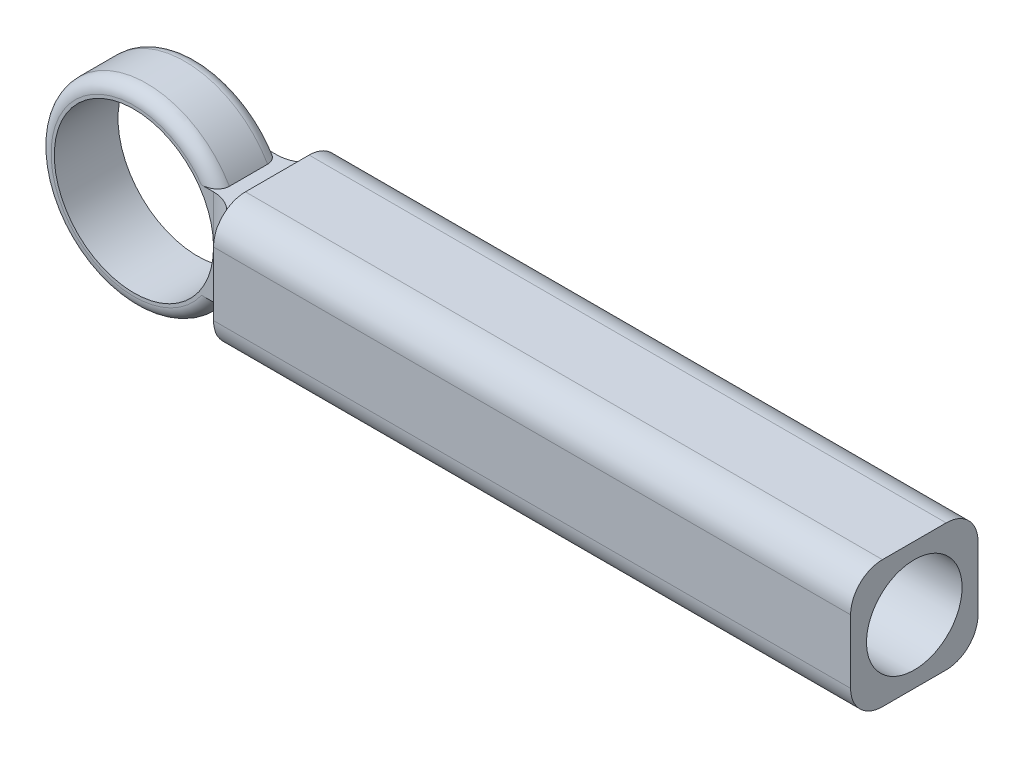
ISO-10303-21;
HEADER;
FILE_DESCRIPTION(('STEP AP214'),'2;1');
FILE_NAME('part.step','',(''),(''),'','','');
FILE_SCHEMA(('AUTOMOTIVE_DESIGN { 1 0 10303 214 1 1 1 1 }'));
ENDSEC;
DATA;
#1=APPLICATION_CONTEXT('core data for automotive mechanical design processes');
#2=APPLICATION_PROTOCOL_DEFINITION('international standard','automotive_design',2000,#1);
#3=PRODUCT_CONTEXT('',#1,'mechanical');
#4=PRODUCT('Part','Part','',(#3));
#5=PRODUCT_RELATED_PRODUCT_CATEGORY('part','',(#4));
#6=PRODUCT_DEFINITION_FORMATION('','',#4);
#7=PRODUCT_DEFINITION_CONTEXT('part definition',#1,'design');
#8=PRODUCT_DEFINITION('design','',#6,#7);
#9=PRODUCT_DEFINITION_SHAPE('','',#8);
#10=(LENGTH_UNIT() NAMED_UNIT(*) SI_UNIT(.MILLI.,.METRE.));
#11=(NAMED_UNIT(*) PLANE_ANGLE_UNIT() SI_UNIT($,.RADIAN.));
#12=(NAMED_UNIT(*) SI_UNIT($,.STERADIAN.) SOLID_ANGLE_UNIT());
#13=UNCERTAINTY_MEASURE_WITH_UNIT(LENGTH_MEASURE(1.E-05),#10,'distance_accuracy_value','');
#14=(GEOMETRIC_REPRESENTATION_CONTEXT(3) GLOBAL_UNCERTAINTY_ASSIGNED_CONTEXT((#13)) GLOBAL_UNIT_ASSIGNED_CONTEXT((#10,
#11,#12)) REPRESENTATION_CONTEXT('',''));
#15=CARTESIAN_POINT('',(0.,0.,0.));
#16=DIRECTION('',(0.,0.,1.));
#17=DIRECTION('',(1.,0.,0.));
#18=AXIS2_PLACEMENT_3D('',#15,#16,#17);
#19=CARTESIAN_POINT('',(3.5,0.,0.));
#20=DIRECTION('',(1.,0.,0.));
#21=DIRECTION('',(0.,0.,-1.));
#22=AXIS2_PLACEMENT_3D('',#19,#20,#21);
#23=PLANE('',#22);
#24=CARTESIAN_POINT('',(3.5,-0.999999999999999,2.));
#25=DIRECTION('',(1.,0.,0.));
#26=DIRECTION('',(0.,0.,-1.));
#27=AXIS2_PLACEMENT_3D('',#24,#25,#26);
#28=CIRCLE('',#27,1.);
#29=CARTESIAN_POINT('',(3.5,-2.,2.));
#30=VERTEX_POINT('',#29);
#31=CARTESIAN_POINT('',(3.5,-1.5,2.86602540378444));
#32=VERTEX_POINT('',#31);
#33=EDGE_CURVE('E463',#30,#32,#28,.F.);
#34=ORIENTED_EDGE('',*,*,#33,.T.);
#35=DIRECTION('',(0.,0.,-1.));
#36=VECTOR('',#35,1.);
#37=CARTESIAN_POINT('',(3.5,-1.5,2.));
#38=LINE('',#37,#36);
#39=CARTESIAN_POINT('',(3.5,-1.5,-0.866025403784438));
#40=VERTEX_POINT('',#39);
#41=EDGE_CURVE('E422',#32,#40,#38,.T.);
#42=ORIENTED_EDGE('',*,*,#41,.T.);
#43=CARTESIAN_POINT('',(3.5,-0.999999999999999,0.));
#44=DIRECTION('',(1.,0.,0.));
#45=DIRECTION('',(0.,0.,-1.));
#46=AXIS2_PLACEMENT_3D('',#43,#44,#45);
#47=CIRCLE('',#46,1.);
#48=CARTESIAN_POINT('',(3.5,-2.,0.));
#49=VERTEX_POINT('',#48);
#50=EDGE_CURVE('E461',#40,#49,#47,.F.);
#51=ORIENTED_EDGE('',*,*,#50,.T.);
#52=DIRECTION('',(0.,0.,-1.));
#53=VECTOR('',#52,1.);
#54=CARTESIAN_POINT('',(3.5,-2.,3.));
#55=LINE('',#54,#53);
#56=EDGE_CURVE('E381',#30,#49,#55,.T.);
#57=ORIENTED_EDGE('',*,*,#56,.F.);
#58=EDGE_LOOP('',(#34,#42,#51,#57));
#59=FACE_BOUND('',#58,.T.);
#60=ADVANCED_FACE('F43',(#59),#23,.F.);
#61=CARTESIAN_POINT('',(0.,0.,2.));
#62=DIRECTION('',(0.,0.,1.));
#63=DIRECTION('',(1.,0.,0.));
#64=AXIS2_PLACEMENT_3D('',#61,#62,#63);
#65=PLANE('',#64);
#66=CARTESIAN_POINT('',(0.,0.,2.));
#67=DIRECTION('',(0.,0.,1.));
#68=DIRECTION('',(1.,0.,0.));
#69=AXIS2_PLACEMENT_3D('',#66,#67,#68);
#70=CIRCLE('',#69,2.6);
#71=CARTESIAN_POINT('',(2.12367605815953,1.5,2.));
#72=VERTEX_POINT('',#71);
#73=CARTESIAN_POINT('',(2.12367605815953,-1.5,2.));
#74=VERTEX_POINT('',#73);
#75=EDGE_CURVE('E400',#72,#74,#70,.T.);
#76=ORIENTED_EDGE('',*,*,#75,.T.);
#77=DIRECTION('',(1.,0.,0.));
#78=VECTOR('',#77,1.);
#79=CARTESIAN_POINT('',(3.5,-1.5,2.));
#80=LINE('',#79,#78);
#81=CARTESIAN_POINT('',(2.5,-1.5,2.));
#82=VERTEX_POINT('',#81);
#83=EDGE_CURVE('E395',#74,#82,#80,.T.);
#84=ORIENTED_EDGE('',*,*,#83,.T.);
#85=DIRECTION('',(0.,1.,0.));
#86=VECTOR('',#85,1.);
#87=CARTESIAN_POINT('',(2.5,0.,2.));
#88=LINE('',#87,#86);
#89=CARTESIAN_POINT('',(2.5,0.,2.));
#90=VERTEX_POINT('',#89);
#91=EDGE_CURVE('E392',#82,#90,#88,.T.);
#92=ORIENTED_EDGE('',*,*,#91,.T.);
#93=CARTESIAN_POINT('',(0.,0.,2.));
#94=DIRECTION('',(0.,0.,1.));
#95=DIRECTION('',(1.,0.,0.));
#96=AXIS2_PLACEMENT_3D('',#93,#94,#95);
#97=CIRCLE('',#96,2.5);
#98=EDGE_CURVE('E428',#90,#90,#97,.T.);
#99=ORIENTED_EDGE('',*,*,#98,.F.);
#100=DIRECTION('',(0.,1.,0.));
#101=VECTOR('',#100,1.);
#102=CARTESIAN_POINT('',(2.5,0.,2.));
#103=LINE('',#102,#101);
#104=CARTESIAN_POINT('',(2.5,1.5,2.));
#105=VERTEX_POINT('',#104);
#106=EDGE_CURVE('E427',#90,#105,#103,.T.);
#107=ORIENTED_EDGE('',*,*,#106,.T.);
#108=DIRECTION('',(-1.,0.,0.));
#109=VECTOR('',#108,1.);
#110=CARTESIAN_POINT('',(2.59807621135332,1.5,2.));
#111=LINE('',#110,#109);
#112=EDGE_CURVE('E231',#105,#72,#111,.T.);
#113=ORIENTED_EDGE('',*,*,#112,.T.);
#114=EDGE_LOOP('',(#76,#84,#92,#99,#107,#113));
#115=FACE_BOUND('',#114,.T.);
#116=ADVANCED_FACE('F332',(#115),#65,.T.);
#117=CARTESIAN_POINT('',(0.,0.,0.));
#118=DIRECTION('',(0.,0.,1.));
#119=DIRECTION('',(1.,0.,0.));
#120=AXIS2_PLACEMENT_3D('',#117,#118,#119);
#121=PLANE('',#120);
#122=DIRECTION('',(0.,1.,0.));
#123=VECTOR('',#122,1.);
#124=CARTESIAN_POINT('',(2.5,-1.5,0.));
#125=LINE('',#124,#123);
#126=CARTESIAN_POINT('',(2.5,0.,0.));
#127=VERTEX_POINT('',#126);
#128=CARTESIAN_POINT('',(2.5,-1.5,0.));
#129=VERTEX_POINT('',#128);
#130=EDGE_CURVE('E433',#127,#129,#125,.F.);
#131=ORIENTED_EDGE('',*,*,#130,.T.);
#132=DIRECTION('',(-1.,0.,0.));
#133=VECTOR('',#132,1.);
#134=CARTESIAN_POINT('',(0.,-1.5,0.));
#135=LINE('',#134,#133);
#136=CARTESIAN_POINT('',(2.12367605815953,-1.5,0.));
#137=VERTEX_POINT('',#136);
#138=EDGE_CURVE('E413',#129,#137,#135,.T.);
#139=ORIENTED_EDGE('',*,*,#138,.T.);
#140=CARTESIAN_POINT('',(0.,0.,0.));
#141=DIRECTION('',(0.,0.,1.));
#142=DIRECTION('',(1.,0.,0.));
#143=AXIS2_PLACEMENT_3D('',#140,#141,#142);
#144=CIRCLE('',#143,2.6);
#145=CARTESIAN_POINT('',(2.12367605815953,1.5,0.));
#146=VERTEX_POINT('',#145);
#147=EDGE_CURVE('E411',#137,#146,#144,.F.);
#148=ORIENTED_EDGE('',*,*,#147,.T.);
#149=DIRECTION('',(1.,0.,0.));
#150=VECTOR('',#149,1.);
#151=CARTESIAN_POINT('',(0.,1.5,0.));
#152=LINE('',#151,#150);
#153=CARTESIAN_POINT('',(2.5,1.5,0.));
#154=VERTEX_POINT('',#153);
#155=EDGE_CURVE('E408',#146,#154,#152,.T.);
#156=ORIENTED_EDGE('',*,*,#155,.T.);
#157=DIRECTION('',(0.,1.,0.));
#158=VECTOR('',#157,1.);
#159=CARTESIAN_POINT('',(2.5,-1.5,0.));
#160=LINE('',#159,#158);
#161=EDGE_CURVE('E429',#154,#127,#160,.F.);
#162=ORIENTED_EDGE('',*,*,#161,.T.);
#163=CARTESIAN_POINT('',(0.,0.,0.));
#164=DIRECTION('',(0.,0.,1.));
#165=DIRECTION('',(1.,0.,0.));
#166=AXIS2_PLACEMENT_3D('',#163,#164,#165);
#167=CIRCLE('',#166,2.5);
#168=EDGE_CURVE('E468',#127,#127,#167,.T.);
#169=ORIENTED_EDGE('',*,*,#168,.T.);
#170=EDGE_LOOP('',(#131,#139,#148,#156,#162,#169));
#171=FACE_BOUND('',#170,.T.);
#172=ADVANCED_FACE('F319',(#171),#121,.F.);
#173=CARTESIAN_POINT('',(0.,0.,2.));
#174=DIRECTION('',(0.,0.,-1.));
#175=DIRECTION('',(-1.,0.,0.));
#176=AXIS2_PLACEMENT_3D('',#173,#174,#175);
#177=CYLINDRICAL_SURFACE('',#176,3.);
#178=DIRECTION('',(0.,0.,-1.));
#179=VECTOR('',#178,1.);
#180=CARTESIAN_POINT('',(2.59807621135332,-1.5,2.));
#181=LINE('',#180,#179);
#182=CARTESIAN_POINT('',(2.59807621135332,-1.5,1.6));
#183=VERTEX_POINT('',#182);
#184=CARTESIAN_POINT('',(2.59807621135332,-1.5,0.4));
#185=VERTEX_POINT('',#184);
#186=EDGE_CURVE('E193',#183,#185,#181,.T.);
#187=ORIENTED_EDGE('',*,*,#186,.F.);
#188=CARTESIAN_POINT('',(0.,0.,1.6));
#189=DIRECTION('',(0.,0.,1.));
#190=DIRECTION('',(1.,0.,0.));
#191=AXIS2_PLACEMENT_3D('',#188,#189,#190);
#192=CIRCLE('',#191,3.);
#193=CARTESIAN_POINT('',(2.59807621135332,1.5,1.6));
#194=VERTEX_POINT('',#193);
#195=EDGE_CURVE('E404',#183,#194,#192,.F.);
#196=ORIENTED_EDGE('',*,*,#195,.T.);
#197=DIRECTION('',(0.,0.,-1.));
#198=VECTOR('',#197,1.);
#199=CARTESIAN_POINT('',(2.59807621135332,1.5,2.));
#200=LINE('',#199,#198);
#201=CARTESIAN_POINT('',(2.59807621135332,1.5,0.4));
#202=VERTEX_POINT('',#201);
#203=EDGE_CURVE('E426',#194,#202,#200,.T.);
#204=ORIENTED_EDGE('',*,*,#203,.T.);
#205=CARTESIAN_POINT('',(0.,0.,0.4));
#206=DIRECTION('',(0.,0.,1.));
#207=DIRECTION('',(1.,0.,0.));
#208=AXIS2_PLACEMENT_3D('',#205,#206,#207);
#209=CIRCLE('',#208,3.);
#210=EDGE_CURVE('E401',#202,#185,#209,.T.);
#211=ORIENTED_EDGE('',*,*,#210,.T.);
#212=EDGE_LOOP('',(#187,#196,#204,#211));
#213=FACE_BOUND('',#212,.T.);
#214=ADVANCED_FACE('F324',(#213),#177,.T.);
#215=CARTESIAN_POINT('',(3.5,-1.5,2.));
#216=DIRECTION('',(0.,1.,0.));
#217=DIRECTION('',(0.,0.,1.));
#218=AXIS2_PLACEMENT_3D('',#215,#216,#217);
#219=PLANE('',#218);
#220=CARTESIAN_POINT('',(2.5,-1.5,-1.));
#221=DIRECTION('',(0.,1.,0.));
#222=DIRECTION('',(0.,0.,1.));
#223=AXIS2_PLACEMENT_3D('',#220,#221,#222);
#224=CIRCLE('',#223,1.);
#225=CARTESIAN_POINT('',(3.49098476656752,-1.5,-0.866025403784438));
#226=VERTEX_POINT('',#225);
#227=EDGE_CURVE('E64',#129,#226,#224,.T.);
#228=ORIENTED_EDGE('',*,*,#227,.T.);
#229=DIRECTION('',(-1.,0.,0.));
#230=VECTOR('',#229,1.);
#231=CARTESIAN_POINT('',(3.5,-1.5,-0.866025403784438));
#232=LINE('',#231,#230);
#233=EDGE_CURVE('E224',#226,#40,#232,.F.);
#234=ORIENTED_EDGE('',*,*,#233,.T.);
#235=ORIENTED_EDGE('',*,*,#41,.F.);
#236=DIRECTION('',(1.,0.,0.));
#237=VECTOR('',#236,1.);
#238=CARTESIAN_POINT('',(3.49098476656752,-1.5,2.86602540378444));
#239=LINE('',#238,#237);
#240=CARTESIAN_POINT('',(3.49098476656752,-1.5,2.86602540378444));
#241=VERTEX_POINT('',#240);
#242=EDGE_CURVE('E222',#32,#241,#239,.F.);
#243=ORIENTED_EDGE('',*,*,#242,.T.);
#244=CARTESIAN_POINT('',(2.5,-1.5,3.));
#245=DIRECTION('',(0.,1.,0.));
#246=DIRECTION('',(0.,0.,1.));
#247=AXIS2_PLACEMENT_3D('',#244,#245,#246);
#248=CIRCLE('',#247,1.);
#249=EDGE_CURVE('E220',#241,#82,#248,.T.);
#250=ORIENTED_EDGE('',*,*,#249,.T.);
#251=ORIENTED_EDGE('',*,*,#83,.F.);
#252=CARTESIAN_POINT('',(2.12367605815953,-1.5,2.));
#253=CARTESIAN_POINT('',(2.15758585713339,-1.5,2.00001594511872));
#254=CARTESIAN_POINT('',(2.19160700873993,-1.5,1.99712058292618));
#255=CARTESIAN_POINT('',(2.25871829493161,-1.5,1.98524059464232));
#256=CARTESIAN_POINT('',(2.2918033616741,-1.5,1.97622770154308));
#257=CARTESIAN_POINT('',(2.34807344863793,-1.5,1.95470101168538));
#258=CARTESIAN_POINT('',(2.37176046944167,-1.5,1.94350407902903));
#259=CARTESIAN_POINT('',(2.4169449606432,-1.5,1.91737917499726));
#260=CARTESIAN_POINT('',(2.43844661310747,-1.5,1.90245852624708));
#261=CARTESIAN_POINT('',(2.47861366374873,-1.5,1.86886583896444));
#262=CARTESIAN_POINT('',(2.49725505420123,-1.5,1.85016480876899));
#263=CARTESIAN_POINT('',(2.53053058040978,-1.5,1.80944706330995));
#264=CARTESIAN_POINT('',(2.54516535009081,-1.5,1.7874308734242));
#265=CARTESIAN_POINT('',(2.56782449846648,-1.5,1.74399924746709));
#266=CARTESIAN_POINT('',(2.5764779732599,-1.5,1.7229108974363));
#267=CARTESIAN_POINT('',(2.58959711767569,-1.5,1.67949612879297));
#268=CARTESIAN_POINT('',(2.59407438084941,-1.5,1.65717332099209));
#269=CARTESIAN_POINT('',(2.59691758118529,-1.5,1.62890627121276));
#270=CARTESIAN_POINT('',(2.59735213368728,-1.5,1.6231293295965));
#271=CARTESIAN_POINT('',(2.59793096041084,-1.5,1.61156916816617));
#272=CARTESIAN_POINT('',(2.59807564761839,-1.5,1.60578596904679));
#273=CARTESIAN_POINT('',(2.59807621135332,-1.5,1.6));
#274=B_SPLINE_CURVE_WITH_KNOTS('',3,(#252,#253,#254,#255,#256,#257,#258,#259,#260,#261,#262,
#263,#264,#265,#266,#267,#268,#269,#270,#271,#272,#273),.UNSPECIFIED.,.F.,.F.,(4,2,2,2,2,2,2,2,
2,2,4),(0.,0.101790309340811,0.20405418768438,0.282333468915692,0.360460011743565,
0.439210131703286,0.517947784659056,0.585954095671942,0.653771048006571,0.671146386877188,
0.688496952554313),.UNSPECIFIED.);
#275=EDGE_CURVE('E295',#74,#183,#274,.T.);
#276=ORIENTED_EDGE('',*,*,#275,.T.);
#277=ORIENTED_EDGE('',*,*,#186,.T.);
#278=CARTESIAN_POINT('',(2.59807621135332,-1.5,0.4));
#279=CARTESIAN_POINT('',(2.59810523239083,-1.5,0.379736288779023));
#280=CARTESIAN_POINT('',(2.59630032819509,-1.5,0.359493173056112));
#281=CARTESIAN_POINT('',(2.58925527858618,-1.5,0.319694954398469));
#282=CARTESIAN_POINT('',(2.58402904895933,-1.5,0.300137401083211));
#283=CARTESIAN_POINT('',(2.57037530130759,-1.5,0.262197205596292));
#284=CARTESIAN_POINT('',(2.56194998191511,-1.5,0.243813766607403));
#285=CARTESIAN_POINT('',(2.54226366848401,-1.5,0.208627042029602));
#286=CARTESIAN_POINT('',(2.53100051713219,-1.5,0.191824972001496));
#287=CARTESIAN_POINT('',(2.50548588387801,-1.5,0.159397956274254));
#288=CARTESIAN_POINT('',(2.4911206336654,-1.5,0.143862904032949));
#289=CARTESIAN_POINT('',(2.46025242501246,-1.5,0.115105431437132));
#290=CARTESIAN_POINT('',(2.44374934475632,-1.5,0.101883142967315));
#291=CARTESIAN_POINT('',(2.40690622930586,-1.5,0.0763561290609208));
#292=CARTESIAN_POINT('',(2.38634439858952,-1.5,0.0643721556439394));
#293=CARTESIAN_POINT('',(2.34368426868376,-1.5,0.0434877432512681));
#294=CARTESIAN_POINT('',(2.32158335879466,-1.5,0.0345927048362297));
#295=CARTESIAN_POINT('',(2.2707121652535,-1.5,0.0180145681281334));
#296=CARTESIAN_POINT('',(2.24166058517029,-1.5,0.0111964952975033));
#297=CARTESIAN_POINT('',(2.18294256544403,-1.5,0.00219367168048551));
#298=CARTESIAN_POINT('',(2.15327857439571,-1.5,-6.87900282646229E-06));
#299=CARTESIAN_POINT('',(2.12367605815953,-1.5,0.));
#300=B_SPLINE_CURVE_WITH_KNOTS('',3,(#278,#279,#280,#281,#282,#283,#284,#285,#286,#287,#288,
#289,#290,#291,#292,#293,#294,#295,#296,#297,#298,#299),.UNSPECIFIED.,.F.,.F.,(4,2,2,2,2,2,2,2,
2,2,4),(0.,0.0606786315460023,0.121111981538572,0.181503872574434,0.241941812637233,
0.305164170117127,0.368390131659381,0.439511226408976,0.510756047468925,0.599888741430194,
0.688715947022926),.UNSPECIFIED.);
#301=EDGE_CURVE('E57',#185,#137,#300,.T.);
#302=ORIENTED_EDGE('',*,*,#301,.T.);
#303=ORIENTED_EDGE('',*,*,#138,.F.);
#304=EDGE_LOOP('',(#228,#234,#235,#243,#250,#251,#276,#277,#302,#303));
#305=FACE_BOUND('',#304,.T.);
#306=ADVANCED_FACE('F317',(#305),#219,.F.);
#307=CARTESIAN_POINT('',(2.59807621135332,1.5,2.));
#308=DIRECTION('',(0.,-1.,0.));
#309=DIRECTION('',(0.,0.,-1.));
#310=AXIS2_PLACEMENT_3D('',#307,#308,#309);
#311=PLANE('',#310);
#312=DIRECTION('',(0.,0.,-1.));
#313=VECTOR('',#312,1.);
#314=CARTESIAN_POINT('',(3.5,1.5,2.));
#315=LINE('',#314,#313);
#316=CARTESIAN_POINT('',(3.5,1.5,2.86602540378444));
#317=VERTEX_POINT('',#316);
#318=CARTESIAN_POINT('',(3.5,1.5,-0.866025403784439));
#319=VERTEX_POINT('',#318);
#320=EDGE_CURVE('E187',#317,#319,#315,.T.);
#321=ORIENTED_EDGE('',*,*,#320,.T.);
#322=DIRECTION('',(1.,0.,0.));
#323=VECTOR('',#322,1.);
#324=CARTESIAN_POINT('',(3.49098476656752,1.5,-0.866025403784439));
#325=LINE('',#324,#323);
#326=CARTESIAN_POINT('',(3.49098476656752,1.5,-0.866025403784439));
#327=VERTEX_POINT('',#326);
#328=EDGE_CURVE('E227',#319,#327,#325,.F.);
#329=ORIENTED_EDGE('',*,*,#328,.T.);
#330=CARTESIAN_POINT('',(2.5,1.5,-1.));
#331=DIRECTION('',(0.,-1.,0.));
#332=DIRECTION('',(0.,0.,-1.));
#333=AXIS2_PLACEMENT_3D('',#330,#331,#332);
#334=CIRCLE('',#333,1.);
#335=EDGE_CURVE('E211',#327,#154,#334,.T.);
#336=ORIENTED_EDGE('',*,*,#335,.T.);
#337=ORIENTED_EDGE('',*,*,#155,.F.);
#338=CARTESIAN_POINT('',(2.12367605815953,1.5,0.));
#339=CARTESIAN_POINT('',(2.15758585713339,1.5,-1.59451187244736E-05));
#340=CARTESIAN_POINT('',(2.19160700873993,1.5,0.00287941707381768));
#341=CARTESIAN_POINT('',(2.2587182949316,1.5,0.0147594053576848));
#342=CARTESIAN_POINT('',(2.2918033616741,1.5,0.0237722984569201));
#343=CARTESIAN_POINT('',(2.34807344863793,1.5,0.0452989883146156));
#344=CARTESIAN_POINT('',(2.37176046944167,1.5,0.0564959209709728));
#345=CARTESIAN_POINT('',(2.4169449606432,1.5,0.0826208250027382));
#346=CARTESIAN_POINT('',(2.43844661310747,1.5,0.0975414737529169));
#347=CARTESIAN_POINT('',(2.47861366374873,1.5,0.131134161035564));
#348=CARTESIAN_POINT('',(2.49725505420123,1.5,0.149835191231006));
#349=CARTESIAN_POINT('',(2.53053058040978,1.5,0.190552936690047));
#350=CARTESIAN_POINT('',(2.54516535009081,1.5,0.212569126575802));
#351=CARTESIAN_POINT('',(2.56782449846648,1.5,0.256000752532909));
#352=CARTESIAN_POINT('',(2.5764779732599,1.5,0.277089102563697));
#353=CARTESIAN_POINT('',(2.58959711767569,1.5,0.320503871207031));
#354=CARTESIAN_POINT('',(2.59407438084941,1.5,0.342826679007912));
#355=CARTESIAN_POINT('',(2.59691758118529,1.5,0.371093728787236));
#356=CARTESIAN_POINT('',(2.59735213368728,1.5,0.376870670403498));
#357=CARTESIAN_POINT('',(2.59793096041084,1.5,0.388430831833833));
#358=CARTESIAN_POINT('',(2.59807564761839,1.5,0.394214030953213));
#359=CARTESIAN_POINT('',(2.59807621135332,1.5,0.4));
#360=B_SPLINE_CURVE_WITH_KNOTS('',3,(#338,#339,#340,#341,#342,#343,#344,#345,#346,#347,#348,
#349,#350,#351,#352,#353,#354,#355,#356,#357,#358,#359),.UNSPECIFIED.,.F.,.F.,(4,2,2,2,2,2,2,2,
2,2,4),(0.,0.101790309340811,0.20405418768438,0.282333468915692,0.360460011743564,
0.439210131703286,0.517947784659056,0.585954095671942,0.65377104800657,0.671146386877187,
0.688496952554314),.UNSPECIFIED.);
#361=EDGE_CURVE('E11',#146,#202,#360,.T.);
#362=ORIENTED_EDGE('',*,*,#361,.T.);
#363=ORIENTED_EDGE('',*,*,#203,.F.);
#364=CARTESIAN_POINT('',(2.59807621135332,1.5,1.6));
#365=CARTESIAN_POINT('',(2.59810523239083,1.5,1.62026371122098));
#366=CARTESIAN_POINT('',(2.59630032819509,1.5,1.64050682694389));
#367=CARTESIAN_POINT('',(2.58925527858618,1.5,1.68030504560153));
#368=CARTESIAN_POINT('',(2.58402904895933,1.5,1.69986259891679));
#369=CARTESIAN_POINT('',(2.57037530130759,1.5,1.73780279440371));
#370=CARTESIAN_POINT('',(2.56194998191511,1.5,1.7561862333926));
#371=CARTESIAN_POINT('',(2.54226366848401,1.5,1.7913729579704));
#372=CARTESIAN_POINT('',(2.53100051713219,1.5,1.8081750279985));
#373=CARTESIAN_POINT('',(2.50548588387801,1.5,1.84060204372575));
#374=CARTESIAN_POINT('',(2.4911206336654,1.5,1.85613709596705));
#375=CARTESIAN_POINT('',(2.46025242501246,1.5,1.88489456856287));
#376=CARTESIAN_POINT('',(2.44374934475632,1.5,1.89811685703269));
#377=CARTESIAN_POINT('',(2.40690622930586,1.5,1.92364387093908));
#378=CARTESIAN_POINT('',(2.38634439858952,1.5,1.93562784435606));
#379=CARTESIAN_POINT('',(2.34368426868376,1.5,1.95651225674873));
#380=CARTESIAN_POINT('',(2.32158335879466,1.5,1.96540729516377));
#381=CARTESIAN_POINT('',(2.2707121652535,1.5,1.98198543187187));
#382=CARTESIAN_POINT('',(2.24166058517029,1.5,1.9888035047025));
#383=CARTESIAN_POINT('',(2.18294256544403,1.5,1.99780632831951));
#384=CARTESIAN_POINT('',(2.15327857439571,1.5,2.00000687900283));
#385=CARTESIAN_POINT('',(2.12367605815953,1.5,2.));
#386=B_SPLINE_CURVE_WITH_KNOTS('',3,(#364,#365,#366,#367,#368,#369,#370,#371,#372,#373,#374,
#375,#376,#377,#378,#379,#380,#381,#382,#383,#384,#385),.UNSPECIFIED.,.F.,.F.,(4,2,2,2,2,2,2,2,
2,2,4),(0.,0.0606786315460023,0.121111981538572,0.181503872574433,0.241941812637234,
0.305164170117127,0.368390131659381,0.439511226408976,0.510756047468925,0.599888741430194,
0.688715947022926),.UNSPECIFIED.);
#387=EDGE_CURVE('E303',#194,#72,#386,.T.);
#388=ORIENTED_EDGE('',*,*,#387,.T.);
#389=ORIENTED_EDGE('',*,*,#112,.F.);
#390=CARTESIAN_POINT('',(2.5,1.5,3.));
#391=DIRECTION('',(0.,-1.,0.));
#392=DIRECTION('',(0.,0.,-1.));
#393=AXIS2_PLACEMENT_3D('',#390,#391,#392);
#394=CIRCLE('',#393,1.);
#395=CARTESIAN_POINT('',(3.49098476656752,1.5,2.86602540378444));
#396=VERTEX_POINT('',#395);
#397=EDGE_CURVE('E72',#105,#396,#394,.T.);
#398=ORIENTED_EDGE('',*,*,#397,.T.);
#399=DIRECTION('',(-1.,0.,0.));
#400=VECTOR('',#399,1.);
#401=CARTESIAN_POINT('',(3.5,1.5,2.86602540378444));
#402=LINE('',#401,#400);
#403=EDGE_CURVE('E229',#396,#317,#402,.F.);
#404=ORIENTED_EDGE('',*,*,#403,.T.);
#405=EDGE_LOOP('',(#321,#329,#336,#337,#362,#363,#388,#389,#398,#404));
#406=FACE_BOUND('',#405,.T.);
#407=ADVANCED_FACE('F312',(#406),#311,.F.);
#408=CARTESIAN_POINT('',(0.,0.,2.));
#409=DIRECTION('',(0.,0.,-1.));
#410=DIRECTION('',(-1.,0.,0.));
#411=AXIS2_PLACEMENT_3D('',#408,#409,#410);
#412=CYLINDRICAL_SURFACE('',#411,2.5);
#413=ORIENTED_EDGE('',*,*,#98,.T.);
#414=EDGE_LOOP('',(#413));
#415=FACE_BOUND('',#414,.T.);
#416=ORIENTED_EDGE('',*,*,#168,.F.);
#417=EDGE_LOOP('',(#416));
#418=FACE_BOUND('',#417,.T.);
#419=ADVANCED_FACE('F316',(#415,#418),#412,.F.);
#420=CARTESIAN_POINT('',(3.5,1.,0.));
#421=DIRECTION('',(1.,0.,0.));
#422=DIRECTION('',(0.,0.,-1.));
#423=AXIS2_PLACEMENT_3D('',#420,#421,#422);
#424=CIRCLE('',#423,1.);
#425=CARTESIAN_POINT('',(3.5,2.,0.));
#426=VERTEX_POINT('',#425);
#427=EDGE_CURVE('E192',#426,#319,#424,.F.);
#428=ORIENTED_EDGE('',*,*,#427,.T.);
#429=ORIENTED_EDGE('',*,*,#320,.F.);
#430=CARTESIAN_POINT('',(3.5,1.,2.));
#431=DIRECTION('',(1.,0.,0.));
#432=DIRECTION('',(0.,0.,-1.));
#433=AXIS2_PLACEMENT_3D('',#430,#431,#432);
#434=CIRCLE('',#433,1.);
#435=CARTESIAN_POINT('',(3.5,2.,2.));
#436=VERTEX_POINT('',#435);
#437=EDGE_CURVE('E181',#317,#436,#434,.F.);
#438=ORIENTED_EDGE('',*,*,#437,.T.);
#439=DIRECTION('',(0.,0.,-1.));
#440=VECTOR('',#439,1.);
#441=CARTESIAN_POINT('',(3.5,2.,3.));
#442=LINE('',#441,#440);
#443=EDGE_CURVE('E185',#436,#426,#442,.T.);
#444=ORIENTED_EDGE('',*,*,#443,.T.);
#445=EDGE_LOOP('',(#428,#429,#438,#444));
#446=FACE_BOUND('',#445,.T.);
#447=ADVANCED_FACE('F184',(#446),#23,.F.);
#448=CARTESIAN_POINT('',(23.5,2.,3.));
#449=DIRECTION('',(0.,1.,0.));
#450=DIRECTION('',(0.,0.,1.));
#451=AXIS2_PLACEMENT_3D('',#448,#449,#450);
#452=PLANE('',#451);
#453=DIRECTION('',(0.,0.,-1.));
#454=VECTOR('',#453,1.);
#455=CARTESIAN_POINT('',(23.5,2.,3.));
#456=LINE('',#455,#454);
#457=CARTESIAN_POINT('',(23.5,2.,2.));
#458=VERTEX_POINT('',#457);
#459=CARTESIAN_POINT('',(23.5,2.,0.));
#460=VERTEX_POINT('',#459);
#461=EDGE_CURVE('E380',#458,#460,#456,.T.);
#462=ORIENTED_EDGE('',*,*,#461,.T.);
#463=DIRECTION('',(-1.,0.,0.));
#464=VECTOR('',#463,1.);
#465=CARTESIAN_POINT('',(3.5,2.,0.));
#466=LINE('',#465,#464);
#467=EDGE_CURVE('E201',#460,#426,#466,.T.);
#468=ORIENTED_EDGE('',*,*,#467,.T.);
#469=ORIENTED_EDGE('',*,*,#443,.F.);
#470=DIRECTION('',(-1.,0.,0.));
#471=VECTOR('',#470,1.);
#472=CARTESIAN_POINT('',(23.5,2.,2.));
#473=LINE('',#472,#471);
#474=EDGE_CURVE('E198',#436,#458,#473,.F.);
#475=ORIENTED_EDGE('',*,*,#474,.T.);
#476=EDGE_LOOP('',(#462,#468,#469,#475));
#477=FACE_BOUND('',#476,.T.);
#478=ADVANCED_FACE('F197',(#477),#452,.T.);
#479=CARTESIAN_POINT('',(23.5,-2.,3.));
#480=DIRECTION('',(0.,0.,1.));
#481=DIRECTION('',(1.,0.,0.));
#482=AXIS2_PLACEMENT_3D('',#479,#480,#481);
#483=PLANE('',#482);
#484=DIRECTION('',(0.,1.,0.));
#485=VECTOR('',#484,1.);
#486=CARTESIAN_POINT('',(3.5,-2.,3.));
#487=LINE('',#486,#485);
#488=CARTESIAN_POINT('',(3.5,-0.999999999999999,3.));
#489=VERTEX_POINT('',#488);
#490=CARTESIAN_POINT('',(3.5,1.,3.));
#491=VERTEX_POINT('',#490);
#492=EDGE_CURVE('E373',#489,#491,#487,.T.);
#493=ORIENTED_EDGE('',*,*,#492,.F.);
#494=DIRECTION('',(-1.,0.,0.));
#495=VECTOR('',#494,1.);
#496=CARTESIAN_POINT('',(23.5,-0.999999999999999,3.));
#497=LINE('',#496,#495);
#498=CARTESIAN_POINT('',(23.5,-0.999999999999999,3.));
#499=VERTEX_POINT('',#498);
#500=EDGE_CURVE('E376',#489,#499,#497,.F.);
#501=ORIENTED_EDGE('',*,*,#500,.T.);
#502=DIRECTION('',(0.,1.,0.));
#503=VECTOR('',#502,1.);
#504=CARTESIAN_POINT('',(23.5,-2.,3.));
#505=LINE('',#504,#503);
#506=CARTESIAN_POINT('',(23.5,1.,3.));
#507=VERTEX_POINT('',#506);
#508=EDGE_CURVE('E480',#499,#507,#505,.T.);
#509=ORIENTED_EDGE('',*,*,#508,.T.);
#510=DIRECTION('',(-1.,0.,0.));
#511=VECTOR('',#510,1.);
#512=CARTESIAN_POINT('',(23.5,1.,3.));
#513=LINE('',#512,#511);
#514=EDGE_CURVE('E378',#507,#491,#513,.T.);
#515=ORIENTED_EDGE('',*,*,#514,.T.);
#516=EDGE_LOOP('',(#493,#501,#509,#515));
#517=FACE_BOUND('',#516,.T.);
#518=ADVANCED_FACE('F351',(#517),#483,.T.);
#519=CARTESIAN_POINT('',(23.5,-2.,3.));
#520=DIRECTION('',(0.,1.,0.));
#521=DIRECTION('',(0.,0.,1.));
#522=AXIS2_PLACEMENT_3D('',#519,#520,#521);
#523=PLANE('',#522);
#524=DIRECTION('',(0.,0.,-1.));
#525=VECTOR('',#524,1.);
#526=CARTESIAN_POINT('',(23.5,-2.,3.));
#527=LINE('',#526,#525);
#528=CARTESIAN_POINT('',(23.5,-2.,2.));
#529=VERTEX_POINT('',#528);
#530=CARTESIAN_POINT('',(23.5,-2.,0.));
#531=VERTEX_POINT('',#530);
#532=EDGE_CURVE('E458',#529,#531,#527,.T.);
#533=ORIENTED_EDGE('',*,*,#532,.F.);
#534=DIRECTION('',(-1.,0.,0.));
#535=VECTOR('',#534,1.);
#536=CARTESIAN_POINT('',(3.5,-2.,2.));
#537=LINE('',#536,#535);
#538=EDGE_CURVE('E438',#529,#30,#537,.T.);
#539=ORIENTED_EDGE('',*,*,#538,.T.);
#540=ORIENTED_EDGE('',*,*,#56,.T.);
#541=DIRECTION('',(-1.,0.,0.));
#542=VECTOR('',#541,1.);
#543=CARTESIAN_POINT('',(23.5,-2.,0.));
#544=LINE('',#543,#542);
#545=EDGE_CURVE('E431',#49,#531,#544,.F.);
#546=ORIENTED_EDGE('',*,*,#545,.T.);
#547=EDGE_LOOP('',(#533,#539,#540,#546));
#548=FACE_BOUND('',#547,.T.);
#549=ADVANCED_FACE('F364',(#548),#523,.F.);
#550=CARTESIAN_POINT('',(23.5,-2.,-1.));
#551=DIRECTION('',(0.,0.,1.));
#552=DIRECTION('',(1.,0.,0.));
#553=AXIS2_PLACEMENT_3D('',#550,#551,#552);
#554=PLANE('',#553);
#555=DIRECTION('',(0.,1.,0.));
#556=VECTOR('',#555,1.);
#557=CARTESIAN_POINT('',(23.5,-2.,-1.));
#558=LINE('',#557,#556);
#559=CARTESIAN_POINT('',(23.5,-0.999999999999999,-1.));
#560=VERTEX_POINT('',#559);
#561=CARTESIAN_POINT('',(23.5,1.,-1.));
#562=VERTEX_POINT('',#561);
#563=EDGE_CURVE('E450',#560,#562,#558,.T.);
#564=ORIENTED_EDGE('',*,*,#563,.F.);
#565=DIRECTION('',(-1.,0.,0.));
#566=VECTOR('',#565,1.);
#567=CARTESIAN_POINT('',(23.5,-0.999999999999999,-1.));
#568=LINE('',#567,#566);
#569=CARTESIAN_POINT('',(3.5,-0.999999999999999,-1.));
#570=VERTEX_POINT('',#569);
#571=EDGE_CURVE('E209',#560,#570,#568,.T.);
#572=ORIENTED_EDGE('',*,*,#571,.T.);
#573=DIRECTION('',(0.,1.,0.));
#574=VECTOR('',#573,1.);
#575=CARTESIAN_POINT('',(3.5,-2.,-1.));
#576=LINE('',#575,#574);
#577=CARTESIAN_POINT('',(3.5,1.,-1.));
#578=VERTEX_POINT('',#577);
#579=EDGE_CURVE('E202',#570,#578,#576,.T.);
#580=ORIENTED_EDGE('',*,*,#579,.T.);
#581=DIRECTION('',(-1.,0.,0.));
#582=VECTOR('',#581,1.);
#583=CARTESIAN_POINT('',(23.5,1.,-1.));
#584=LINE('',#583,#582);
#585=EDGE_CURVE('E213',#578,#562,#584,.F.);
#586=ORIENTED_EDGE('',*,*,#585,.T.);
#587=EDGE_LOOP('',(#564,#572,#580,#586));
#588=FACE_BOUND('',#587,.T.);
#589=ADVANCED_FACE('F360',(#588),#554,.F.);
#590=CARTESIAN_POINT('',(23.5,0.,0.));
#591=DIRECTION('',(1.,0.,0.));
#592=DIRECTION('',(0.,0.,-1.));
#593=AXIS2_PLACEMENT_3D('',#590,#591,#592);
#594=PLANE('',#593);
#595=CARTESIAN_POINT('',(23.5,0.,1.));
#596=DIRECTION('',(1.,0.,0.));
#597=DIRECTION('',(0.,0.,-1.));
#598=AXIS2_PLACEMENT_3D('',#595,#596,#597);
#599=CIRCLE('',#598,1.5);
#600=CARTESIAN_POINT('',(23.5,0.,-0.5));
#601=VERTEX_POINT('',#600);
#602=EDGE_CURVE('E492',#601,#601,#599,.T.);
#603=ORIENTED_EDGE('',*,*,#602,.F.);
#604=EDGE_LOOP('',(#603));
#605=FACE_BOUND('',#604,.T.);
#606=ORIENTED_EDGE('',*,*,#508,.F.);
#607=CARTESIAN_POINT('',(23.5,-0.999999999999999,2.));
#608=DIRECTION('',(1.,0.,0.));
#609=DIRECTION('',(0.,0.,-1.));
#610=AXIS2_PLACEMENT_3D('',#607,#608,#609);
#611=CIRCLE('',#610,1.);
#612=EDGE_CURVE('E389',#499,#529,#611,.T.);
#613=ORIENTED_EDGE('',*,*,#612,.T.);
#614=ORIENTED_EDGE('',*,*,#532,.T.);
#615=CARTESIAN_POINT('',(23.5,-0.999999999999999,0.));
#616=DIRECTION('',(1.,0.,0.));
#617=DIRECTION('',(0.,0.,-1.));
#618=AXIS2_PLACEMENT_3D('',#615,#616,#617);
#619=CIRCLE('',#618,1.);
#620=EDGE_CURVE('E444',#531,#560,#619,.T.);
#621=ORIENTED_EDGE('',*,*,#620,.T.);
#622=ORIENTED_EDGE('',*,*,#563,.T.);
#623=CARTESIAN_POINT('',(23.5,1.,0.));
#624=DIRECTION('',(1.,0.,0.));
#625=DIRECTION('',(0.,0.,-1.));
#626=AXIS2_PLACEMENT_3D('',#623,#624,#625);
#627=CIRCLE('',#626,1.);
#628=EDGE_CURVE('E442',#562,#460,#627,.T.);
#629=ORIENTED_EDGE('',*,*,#628,.T.);
#630=ORIENTED_EDGE('',*,*,#461,.F.);
#631=CARTESIAN_POINT('',(23.5,1.,2.));
#632=DIRECTION('',(1.,0.,0.));
#633=DIRECTION('',(0.,0.,-1.));
#634=AXIS2_PLACEMENT_3D('',#631,#632,#633);
#635=CIRCLE('',#634,1.);
#636=EDGE_CURVE('E208',#458,#507,#635,.T.);
#637=ORIENTED_EDGE('',*,*,#636,.T.);
#638=EDGE_LOOP('',(#606,#613,#614,#621,#622,#629,#630,#637));
#639=FACE_BOUND('',#638,.T.);
#640=ADVANCED_FACE('F363',(#605,#639),#594,.T.);
#641=CARTESIAN_POINT('',(5.,0.,1.));
#642=DIRECTION('',(1.,0.,0.));
#643=DIRECTION('',(0.,0.,-1.));
#644=AXIS2_PLACEMENT_3D('',#641,#642,#643);
#645=CYLINDRICAL_SURFACE('',#644,1.5);
#646=CARTESIAN_POINT('',(5.,0.,1.));
#647=DIRECTION('',(1.,0.,0.));
#648=DIRECTION('',(0.,0.,-1.));
#649=AXIS2_PLACEMENT_3D('',#646,#647,#648);
#650=CIRCLE('',#649,1.5);
#651=CARTESIAN_POINT('',(5.,0.,-0.5));
#652=VERTEX_POINT('',#651);
#653=EDGE_CURVE('E203',#652,#652,#650,.T.);
#654=ORIENTED_EDGE('',*,*,#653,.F.);
#655=EDGE_LOOP('',(#654));
#656=FACE_BOUND('',#655,.T.);
#657=ORIENTED_EDGE('',*,*,#602,.T.);
#658=EDGE_LOOP('',(#657));
#659=FACE_BOUND('',#658,.T.);
#660=ADVANCED_FACE('F499',(#656,#659),#645,.F.);
#661=CARTESIAN_POINT('',(5.,0.,1.));
#662=DIRECTION('',(1.,0.,0.));
#663=DIRECTION('',(0.,0.,-1.));
#664=AXIS2_PLACEMENT_3D('',#661,#662,#663);
#665=PLANE('',#664);
#666=ORIENTED_EDGE('',*,*,#653,.T.);
#667=EDGE_LOOP('',(#666));
#668=FACE_BOUND('',#667,.T.);
#669=ADVANCED_FACE('F259',(#668),#665,.T.);
#670=CARTESIAN_POINT('',(23.5,-0.999999999999999,0.));
#671=DIRECTION('',(-1.,0.,0.));
#672=DIRECTION('',(0.,0.,1.));
#673=AXIS2_PLACEMENT_3D('',#670,#671,#672);
#674=CYLINDRICAL_SURFACE('',#673,1.);
#675=ORIENTED_EDGE('',*,*,#50,.F.);
#676=ORIENTED_EDGE('',*,*,#233,.F.);
#677=CARTESIAN_POINT('',(3.5,-0.999999999999999,-1.));
#678=CARTESIAN_POINT('',(3.499992886634,-1.02826678723446,-1.00000057574994));
#679=CARTESIAN_POINT('',(3.50000071229728,-1.05652165813042,-0.998801007492749));
#680=CARTESIAN_POINT('',(3.49998639044003,-1.11282629092561,-0.994016413176768));
#681=CARTESIAN_POINT('',(3.4999642454277,-1.14087606979124,-0.990431586750201));
#682=CARTESIAN_POINT('',(3.49976696494838,-1.22284793018748,-0.976395988785248));
#683=CARTESIAN_POINT('',(3.49946732028143,-1.27624095747381,-0.962658500186937));
#684=CARTESIAN_POINT('',(3.49746306322075,-1.38010778341519,-0.926575823658748));
#685=CARTESIAN_POINT('',(3.49575650534312,-1.43057743612912,-0.904218739328271));
#686=CARTESIAN_POINT('',(3.49085858701276,-1.50357138432328,-0.864416703322467));
#687=CARTESIAN_POINT('',(3.48878929576575,-1.52777400799345,-0.849851063231555));
#688=CARTESIAN_POINT('',(3.4835683787996,-1.57480004010964,-0.818780253415083));
#689=CARTESIAN_POINT('',(3.48041598181276,-1.59762245206558,-0.80227370711603));
#690=CARTESIAN_POINT('',(3.47658672296933,-1.61965296750943,-0.78487591366837));
#691=B_SPLINE_CURVE_WITH_KNOTS('',3,(#677,#678,#679,#680,#681,#682,#683,#684,#685,#686,#687,
#688,#689,#690),.UNSPECIFIED.,.F.,.F.,(4,2,2,2,2,2,4),(0.,0.0847512806782996,0.169495469059914,
0.334101342163143,0.498935215310839,0.583797635241818,0.668720610445147),.UNSPECIFIED.);
#692=EDGE_CURVE('E240',#570,#226,#691,.T.);
#693=ORIENTED_EDGE('',*,*,#692,.F.);
#694=ORIENTED_EDGE('',*,*,#571,.F.);
#695=ORIENTED_EDGE('',*,*,#620,.F.);
#696=ORIENTED_EDGE('',*,*,#545,.F.);
#697=EDGE_LOOP('',(#675,#676,#693,#694,#695,#696));
#698=FACE_BOUND('',#697,.T.);
#699=ADVANCED_FACE('F255',(#698),#674,.T.);
#700=CARTESIAN_POINT('',(23.5,1.,0.));
#701=DIRECTION('',(1.,0.,0.));
#702=DIRECTION('',(0.,0.,-1.));
#703=AXIS2_PLACEMENT_3D('',#700,#701,#702);
#704=CYLINDRICAL_SURFACE('',#703,1.);
#705=ORIENTED_EDGE('',*,*,#628,.F.);
#706=ORIENTED_EDGE('',*,*,#585,.F.);
#707=CARTESIAN_POINT('',(3.5,1.,-1.));
#708=CARTESIAN_POINT('',(3.499992886634,1.02826678723446,-1.00000057574994));
#709=CARTESIAN_POINT('',(3.50000071229728,1.05652165813042,-0.998801007492749));
#710=CARTESIAN_POINT('',(3.49998639044003,1.11282629092561,-0.994016413176768));
#711=CARTESIAN_POINT('',(3.4999642454277,1.14087606979125,-0.990431586750201));
#712=CARTESIAN_POINT('',(3.49976696494838,1.22284793018749,-0.976395988785248));
#713=CARTESIAN_POINT('',(3.49946732028143,1.27624095747381,-0.962658500186937));
#714=CARTESIAN_POINT('',(3.49746306322075,1.38010778341519,-0.926575823658748));
#715=CARTESIAN_POINT('',(3.49575650534312,1.43057743612912,-0.904218739328271));
#716=CARTESIAN_POINT('',(3.49085858701276,1.50357138432328,-0.864416703322467));
#717=CARTESIAN_POINT('',(3.48878929576575,1.52777400799345,-0.849851063231555));
#718=CARTESIAN_POINT('',(3.4835683787996,1.57480004010964,-0.818780253415083));
#719=CARTESIAN_POINT('',(3.48041598181276,1.59762245206559,-0.80227370711603));
#720=CARTESIAN_POINT('',(3.47658672296933,1.61965296750943,-0.78487591366837));
#721=B_SPLINE_CURVE_WITH_KNOTS('',3,(#707,#708,#709,#710,#711,#712,#713,#714,#715,#716,#717,
#718,#719,#720),.UNSPECIFIED.,.F.,.F.,(4,2,2,2,2,2,4),(0.,0.0847512806782996,0.169495469059914,
0.334101342163143,0.498935215310839,0.583797635241818,0.668720610445147),.UNSPECIFIED.);
#722=EDGE_CURVE('E232',#327,#578,#721,.F.);
#723=ORIENTED_EDGE('',*,*,#722,.F.);
#724=ORIENTED_EDGE('',*,*,#328,.F.);
#725=ORIENTED_EDGE('',*,*,#427,.F.);
#726=ORIENTED_EDGE('',*,*,#467,.F.);
#727=EDGE_LOOP('',(#705,#706,#723,#724,#725,#726));
#728=FACE_BOUND('',#727,.T.);
#729=ADVANCED_FACE('F251',(#728),#704,.T.);
#730=CARTESIAN_POINT('',(2.5,0.,-1.));
#731=DIRECTION('',(0.,-1.,0.));
#732=DIRECTION('',(0.,0.,-1.));
#733=AXIS2_PLACEMENT_3D('',#730,#731,#732);
#734=CYLINDRICAL_SURFACE('',#733,1.);
#735=ORIENTED_EDGE('',*,*,#227,.F.);
#736=ORIENTED_EDGE('',*,*,#130,.F.);
#737=ORIENTED_EDGE('',*,*,#161,.F.);
#738=ORIENTED_EDGE('',*,*,#335,.F.);
#739=ORIENTED_EDGE('',*,*,#722,.T.);
#740=ORIENTED_EDGE('',*,*,#579,.F.);
#741=ORIENTED_EDGE('',*,*,#692,.T.);
#742=EDGE_LOOP('',(#735,#736,#737,#738,#739,#740,#741));
#743=FACE_BOUND('',#742,.T.);
#744=ADVANCED_FACE('F254',(#743),#734,.F.);
#745=CARTESIAN_POINT('',(23.5,1.,2.));
#746=DIRECTION('',(-1.,0.,0.));
#747=DIRECTION('',(0.,0.,1.));
#748=AXIS2_PLACEMENT_3D('',#745,#746,#747);
#749=CYLINDRICAL_SURFACE('',#748,1.);
#750=ORIENTED_EDGE('',*,*,#437,.F.);
#751=ORIENTED_EDGE('',*,*,#403,.F.);
#752=CARTESIAN_POINT('',(3.5,1.,3.));
#753=CARTESIAN_POINT('',(3.499992886634,1.02826678723446,3.00000057574994));
#754=CARTESIAN_POINT('',(3.50000071229728,1.05652165813042,2.99880100749275));
#755=CARTESIAN_POINT('',(3.49998639044003,1.11282629092561,2.99401641317677));
#756=CARTESIAN_POINT('',(3.4999642454277,1.14087606979125,2.9904315867502));
#757=CARTESIAN_POINT('',(3.49976696494838,1.22284793018749,2.97639598878525));
#758=CARTESIAN_POINT('',(3.49946732028143,1.27624095747381,2.96265850018694));
#759=CARTESIAN_POINT('',(3.49746306322075,1.38010778341519,2.92657582365875));
#760=CARTESIAN_POINT('',(3.49575650534312,1.43057743612912,2.90421873932827));
#761=CARTESIAN_POINT('',(3.49085858701276,1.50357138432328,2.86441670332247));
#762=CARTESIAN_POINT('',(3.48878929576575,1.52777400799345,2.84985106323155));
#763=CARTESIAN_POINT('',(3.4835683787996,1.57480004010964,2.81878025341508));
#764=CARTESIAN_POINT('',(3.48041598181276,1.59762245206559,2.80227370711603));
#765=CARTESIAN_POINT('',(3.47658672296933,1.61965296750943,2.78487591366837));
#766=B_SPLINE_CURVE_WITH_KNOTS('',3,(#752,#753,#754,#755,#756,#757,#758,#759,#760,#761,#762,
#763,#764,#765),.UNSPECIFIED.,.F.,.F.,(4,2,2,2,2,2,4),(0.,0.0847512806782994,0.169495469059914,
0.334101342163143,0.498935215310839,0.583797635241818,0.668720610445147),.UNSPECIFIED.);
#767=EDGE_CURVE('E241',#491,#396,#766,.T.);
#768=ORIENTED_EDGE('',*,*,#767,.F.);
#769=ORIENTED_EDGE('',*,*,#514,.F.);
#770=ORIENTED_EDGE('',*,*,#636,.F.);
#771=ORIENTED_EDGE('',*,*,#474,.F.);
#772=EDGE_LOOP('',(#750,#751,#768,#769,#770,#771));
#773=FACE_BOUND('',#772,.T.);
#774=ADVANCED_FACE('F206',(#773),#749,.T.);
#775=CARTESIAN_POINT('',(23.5,-0.999999999999999,2.));
#776=DIRECTION('',(1.,0.,0.));
#777=DIRECTION('',(0.,0.,-1.));
#778=AXIS2_PLACEMENT_3D('',#775,#776,#777);
#779=CYLINDRICAL_SURFACE('',#778,1.);
#780=ORIENTED_EDGE('',*,*,#612,.F.);
#781=ORIENTED_EDGE('',*,*,#500,.F.);
#782=CARTESIAN_POINT('',(3.5,-0.999999999999999,3.));
#783=CARTESIAN_POINT('',(3.499992886634,-1.02826678723446,3.00000057574994));
#784=CARTESIAN_POINT('',(3.50000071229728,-1.05652165813042,2.99880100749275));
#785=CARTESIAN_POINT('',(3.49998639044003,-1.11282629092561,2.99401641317677));
#786=CARTESIAN_POINT('',(3.4999642454277,-1.14087606979124,2.9904315867502));
#787=CARTESIAN_POINT('',(3.49976696494838,-1.22284793018748,2.97639598878525));
#788=CARTESIAN_POINT('',(3.49946732028143,-1.27624095747381,2.96265850018694));
#789=CARTESIAN_POINT('',(3.49746306322075,-1.38010778341519,2.92657582365875));
#790=CARTESIAN_POINT('',(3.49575650534312,-1.43057743612912,2.90421873932827));
#791=CARTESIAN_POINT('',(3.49085858701276,-1.50357138432328,2.86441670332247));
#792=CARTESIAN_POINT('',(3.48878929576575,-1.52777400799345,2.84985106323155));
#793=CARTESIAN_POINT('',(3.4835683787996,-1.57480004010964,2.81878025341508));
#794=CARTESIAN_POINT('',(3.48041598181276,-1.59762245206558,2.80227370711603));
#795=CARTESIAN_POINT('',(3.47658672296933,-1.61965296750943,2.78487591366837));
#796=B_SPLINE_CURVE_WITH_KNOTS('',3,(#782,#783,#784,#785,#786,#787,#788,#789,#790,#791,#792,
#793,#794,#795),.UNSPECIFIED.,.F.,.F.,(4,2,2,2,2,2,4),(0.,0.0847512806782994,0.169495469059914,
0.334101342163143,0.498935215310839,0.583797635241818,0.668720610445147),.UNSPECIFIED.);
#797=EDGE_CURVE('E270',#241,#489,#796,.F.);
#798=ORIENTED_EDGE('',*,*,#797,.F.);
#799=ORIENTED_EDGE('',*,*,#242,.F.);
#800=ORIENTED_EDGE('',*,*,#33,.F.);
#801=ORIENTED_EDGE('',*,*,#538,.F.);
#802=EDGE_LOOP('',(#780,#781,#798,#799,#800,#801));
#803=FACE_BOUND('',#802,.T.);
#804=ADVANCED_FACE('F267',(#803),#779,.T.);
#805=CARTESIAN_POINT('',(2.5,0.,3.));
#806=DIRECTION('',(0.,1.,0.));
#807=DIRECTION('',(0.,0.,1.));
#808=AXIS2_PLACEMENT_3D('',#805,#806,#807);
#809=CYLINDRICAL_SURFACE('',#808,1.);
#810=ORIENTED_EDGE('',*,*,#91,.F.);
#811=ORIENTED_EDGE('',*,*,#249,.F.);
#812=ORIENTED_EDGE('',*,*,#797,.T.);
#813=ORIENTED_EDGE('',*,*,#492,.T.);
#814=ORIENTED_EDGE('',*,*,#767,.T.);
#815=ORIENTED_EDGE('',*,*,#397,.F.);
#816=ORIENTED_EDGE('',*,*,#106,.F.);
#817=EDGE_LOOP('',(#810,#811,#812,#813,#814,#815,#816));
#818=FACE_BOUND('',#817,.T.);
#819=ADVANCED_FACE('F287',(#818),#809,.F.);
#820=CARTESIAN_POINT('',(0.,0.,1.6));
#821=DIRECTION('',(0.,0.,1.));
#822=DIRECTION('',(1.,0.,0.));
#823=AXIS2_PLACEMENT_3D('',#820,#821,#822);
#824=TOROIDAL_SURFACE('',#823,2.6,0.4);
#825=ORIENTED_EDGE('',*,*,#387,.F.);
#826=ORIENTED_EDGE('',*,*,#195,.F.);
#827=ORIENTED_EDGE('',*,*,#275,.F.);
#828=ORIENTED_EDGE('',*,*,#75,.F.);
#829=EDGE_LOOP('',(#825,#826,#827,#828));
#830=FACE_BOUND('',#829,.T.);
#831=ADVANCED_FACE('F289',(#830),#824,.T.);
#832=CARTESIAN_POINT('',(0.,0.,0.4));
#833=DIRECTION('',(0.,0.,1.));
#834=DIRECTION('',(1.,0.,0.));
#835=AXIS2_PLACEMENT_3D('',#832,#833,#834);
#836=TOROIDAL_SURFACE('',#835,2.6,0.4);
#837=ORIENTED_EDGE('',*,*,#361,.F.);
#838=ORIENTED_EDGE('',*,*,#147,.F.);
#839=ORIENTED_EDGE('',*,*,#301,.F.);
#840=ORIENTED_EDGE('',*,*,#210,.F.);
#841=EDGE_LOOP('',(#837,#838,#839,#840));
#842=FACE_BOUND('',#841,.T.);
#843=ADVANCED_FACE('F45',(#842),#836,.T.);
#844=CLOSED_SHELL('',(#60,#116,#172,#214,#306,#407,#419,#447,#478,#518,#549,#589,#640,#660,#669,
#699,#729,#744,#774,#804,#819,#831,#843));
#845=MANIFOLD_SOLID_BREP('B2',#844);
#846=ADVANCED_BREP_SHAPE_REPRESENTATION('',(#18,#845),#14);
#847=SHAPE_DEFINITION_REPRESENTATION(#9,#846);
ENDSEC;
END-ISO-10303-21;
